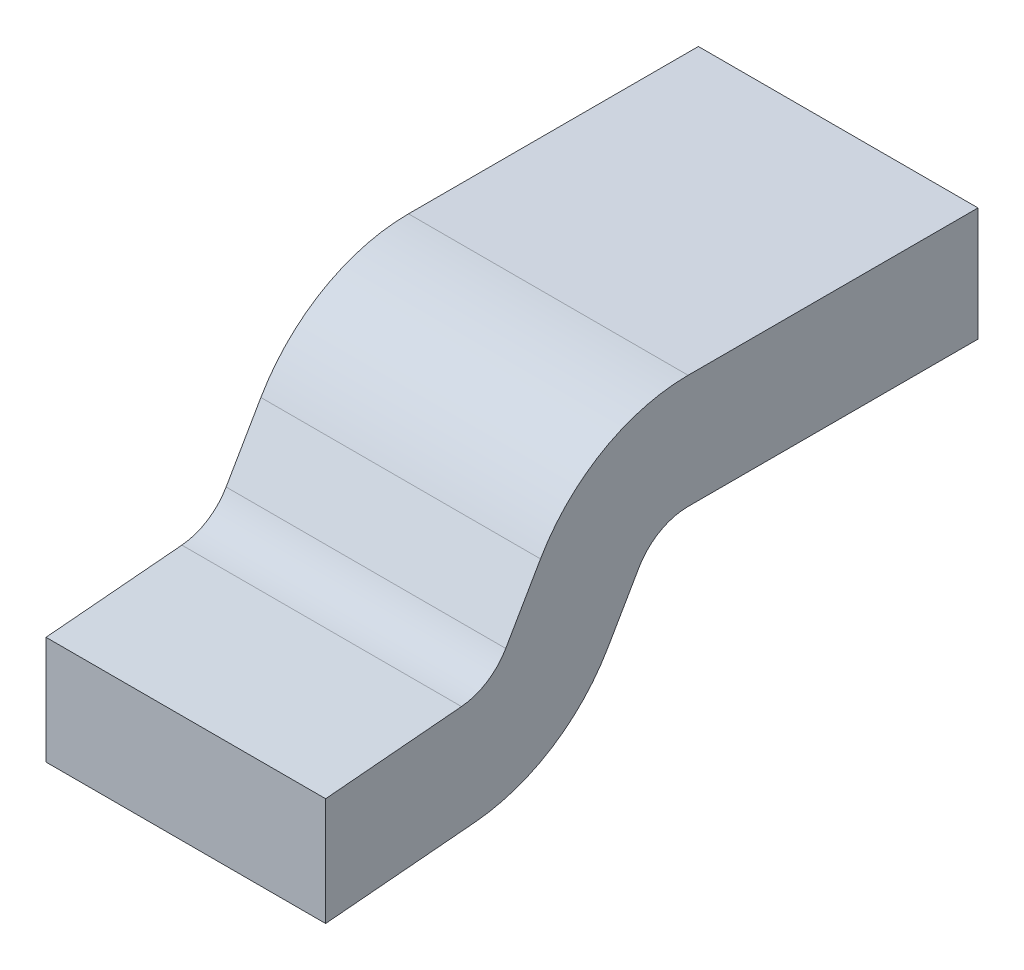
ISO-10303-21;
HEADER;
FILE_DESCRIPTION(('STEP AP214'),'2;1');
FILE_NAME('part.step','',(''),(''),'','','');
FILE_SCHEMA(('AUTOMOTIVE_DESIGN { 1 0 10303 214 1 1 1 1 }'));
ENDSEC;
DATA;
#1=APPLICATION_CONTEXT('core data for automotive mechanical design processes');
#2=APPLICATION_PROTOCOL_DEFINITION('international standard','automotive_design',2000,#1);
#3=PRODUCT_CONTEXT('',#1,'mechanical');
#4=PRODUCT('Part','Part','',(#3));
#5=PRODUCT_RELATED_PRODUCT_CATEGORY('part','',(#4));
#6=PRODUCT_DEFINITION_FORMATION('','',#4);
#7=PRODUCT_DEFINITION_CONTEXT('part definition',#1,'design');
#8=PRODUCT_DEFINITION('design','',#6,#7);
#9=PRODUCT_DEFINITION_SHAPE('','',#8);
#10=(LENGTH_UNIT() NAMED_UNIT(*) SI_UNIT(.MILLI.,.METRE.));
#11=(NAMED_UNIT(*) PLANE_ANGLE_UNIT() SI_UNIT($,.RADIAN.));
#12=(NAMED_UNIT(*) SI_UNIT($,.STERADIAN.) SOLID_ANGLE_UNIT());
#13=UNCERTAINTY_MEASURE_WITH_UNIT(LENGTH_MEASURE(1.E-05),#10,'distance_accuracy_value','');
#14=(GEOMETRIC_REPRESENTATION_CONTEXT(3) GLOBAL_UNCERTAINTY_ASSIGNED_CONTEXT((#13)) GLOBAL_UNIT_ASSIGNED_CONTEXT((#10,
#11,#12)) REPRESENTATION_CONTEXT('',''));
#15=CARTESIAN_POINT('',(0.,0.,0.));
#16=DIRECTION('',(0.,0.,1.));
#17=DIRECTION('',(1.,0.,0.));
#18=AXIS2_PLACEMENT_3D('',#15,#16,#17);
#19=CARTESIAN_POINT('',(-0.375,0.223608840880857,0.398828461671254));
#20=DIRECTION('',(1.,0.,0.));
#21=DIRECTION('',(0.,-0.843391445812889,-0.537299608346818));
#22=AXIS2_PLACEMENT_3D('',#19,#20,#21);
#23=CYLINDRICAL_SURFACE('',#22,0.1524);
#24=CARTESIAN_POINT('',(-0.375,0.223608840880857,0.398828461671254));
#25=DIRECTION('',(-1.,0.,0.));
#26=DIRECTION('',(0.,-0.843391445812889,-0.537299608346818));
#27=AXIS2_PLACEMENT_3D('',#24,#25,#26);
#28=CIRCLE('',#27,0.1524);
#29=CARTESIAN_POINT('',(-0.375,0.147408840880837,0.266846190134476));
#30=VERTEX_POINT('',#29);
#31=CARTESIAN_POINT('',(-0.375,0.0717887688916677,0.385545926476509));
#32=VERTEX_POINT('',#31);
#33=EDGE_CURVE('E11',#30,#32,#28,.T.);
#34=ORIENTED_EDGE('',*,*,#33,.T.);
#35=DIRECTION('',(1.,0.,0.));
#36=VECTOR('',#35,1.);
#37=CARTESIAN_POINT('',(-0.375,0.0717887688916754,0.38554592647651));
#38=LINE('',#37,#36);
#39=CARTESIAN_POINT('',(0.375,0.0717887688916677,0.385545926476509));
#40=VERTEX_POINT('',#39);
#41=EDGE_CURVE('E24',#32,#40,#38,.T.);
#42=ORIENTED_EDGE('',*,*,#41,.T.);
#43=CARTESIAN_POINT('',(0.375,0.223608840880857,0.398828461671254));
#44=DIRECTION('',(1.,0.,0.));
#45=DIRECTION('',(0.,-0.843391445812889,-0.537299608346818));
#46=AXIS2_PLACEMENT_3D('',#43,#44,#45);
#47=CIRCLE('',#46,0.1524);
#48=CARTESIAN_POINT('',(0.375,0.147408840880838,0.266846190134478));
#49=VERTEX_POINT('',#48);
#50=EDGE_CURVE('E202',#40,#49,#47,.T.);
#51=ORIENTED_EDGE('',*,*,#50,.T.);
#52=DIRECTION('',(-1.,0.,0.));
#53=VECTOR('',#52,1.);
#54=CARTESIAN_POINT('',(-0.375,0.147408840880855,0.266846190134507));
#55=LINE('',#54,#53);
#56=EDGE_CURVE('E36',#49,#30,#55,.T.);
#57=ORIENTED_EDGE('',*,*,#56,.T.);
#58=EDGE_LOOP('',(#34,#42,#51,#57));
#59=FACE_BOUND('',#58,.T.);
#60=ADVANCED_FACE('F17',(#59),#23,.F.);
#61=CARTESIAN_POINT('',(-0.375,0.0796796527909721,0.295352710792537));
#62=DIRECTION('',(0.,0.996194698091745,0.087155742747664));
#63=DIRECTION('',(0.,-0.087155742747664,0.996194698091745));
#64=AXIS2_PLACEMENT_3D('',#61,#62,#63);
#65=PLANE('',#64);
#66=ORIENTED_EDGE('',*,*,#41,.F.);
#67=DIRECTION('',(0.,-0.087155742747664,0.996194698091745));
#68=VECTOR('',#67,1.);
#69=CARTESIAN_POINT('',(-0.375,0.0727652026207921,0.374385237882437));
#70=LINE('',#69,#68);
#71=CARTESIAN_POINT('',(-0.375,0.0399031690825243,0.75));
#72=VERTEX_POINT('',#71);
#73=EDGE_CURVE('E199',#32,#72,#70,.T.);
#74=ORIENTED_EDGE('',*,*,#73,.T.);
#75=DIRECTION('',(-1.,0.,0.));
#76=VECTOR('',#75,1.);
#77=CARTESIAN_POINT('',(0.0375,0.0399031690825243,0.75));
#78=LINE('',#77,#76);
#79=CARTESIAN_POINT('',(0.375,0.0399031690825165,0.75));
#80=VERTEX_POINT('',#79);
#81=EDGE_CURVE('E196',#80,#72,#78,.T.);
#82=ORIENTED_EDGE('',*,*,#81,.F.);
#83=DIRECTION('',(0.,-0.087155742747664,0.996194698091745));
#84=VECTOR('',#83,1.);
#85=CARTESIAN_POINT('',(0.375,0.0727652026207921,0.374385237882437));
#86=LINE('',#85,#84);
#87=EDGE_CURVE('E194',#40,#80,#86,.T.);
#88=ORIENTED_EDGE('',*,*,#87,.F.);
#89=EDGE_LOOP('',(#66,#74,#82,#88));
#90=FACE_BOUND('',#89,.T.);
#91=ADVANCED_FACE('F204',(#90),#65,.T.);
#92=CARTESIAN_POINT('',(-0.375,0.,0.));
#93=DIRECTION('',(1.,0.,0.));
#94=DIRECTION('',(0.,0.,-1.));
#95=AXIS2_PLACEMENT_3D('',#92,#93,#94);
#96=PLANE('',#95);
#97=DIRECTION('',(0.,0.866025403784429,-0.500000000000017));
#98=VECTOR('',#97,1.);
#99=CARTESIAN_POINT('',(-0.375,0.1643243897794,0.2570799934244));
#100=LINE('',#99,#98);
#101=CARTESIAN_POINT('',(-0.375,0.3088,0.1736669609722));
#102=VERTEX_POINT('',#101);
#103=EDGE_CURVE('E192',#30,#102,#100,.T.);
#104=ORIENTED_EDGE('',*,*,#103,.T.);
#105=CARTESIAN_POINT('',(-0.375,0.0802,-0.222279853638));
#106=DIRECTION('',(-1.,0.,0.));
#107=DIRECTION('',(0.,0.500000000000017,0.866025403784429));
#108=AXIS2_PLACEMENT_3D('',#105,#106,#107);
#109=CIRCLE('',#108,0.4572);
#110=CARTESIAN_POINT('',(-0.375,0.5374,-0.222279853638));
#111=VERTEX_POINT('',#110);
#112=EDGE_CURVE('E190',#102,#111,#109,.T.);
#113=ORIENTED_EDGE('',*,*,#112,.T.);
#114=DIRECTION('',(0.,0.,1.));
#115=VECTOR('',#114,1.);
#116=CARTESIAN_POINT('',(-0.375,0.5374,-0.9998));
#117=LINE('',#116,#115);
#118=CARTESIAN_POINT('',(-0.375,0.5374,-0.9998));
#119=VERTEX_POINT('',#118);
#120=EDGE_CURVE('E187',#119,#111,#117,.T.);
#121=ORIENTED_EDGE('',*,*,#120,.F.);
#122=DIRECTION('',(0.,1.,0.));
#123=VECTOR('',#122,1.);
#124=CARTESIAN_POINT('',(-0.375,0.2326,-0.9998));
#125=LINE('',#124,#123);
#126=CARTESIAN_POINT('',(-0.375,0.2326,-0.9998));
#127=VERTEX_POINT('',#126);
#128=EDGE_CURVE('E184',#127,#119,#125,.T.);
#129=ORIENTED_EDGE('',*,*,#128,.F.);
#130=DIRECTION('',(0.,0.,-1.));
#131=VECTOR('',#130,1.);
#132=CARTESIAN_POINT('',(-0.375,0.2326,-0.222279853638));
#133=LINE('',#132,#131);
#134=CARTESIAN_POINT('',(-0.375,0.2326,-0.222279853638));
#135=VERTEX_POINT('',#134);
#136=EDGE_CURVE('E181',#135,#127,#133,.T.);
#137=ORIENTED_EDGE('',*,*,#136,.F.);
#138=CARTESIAN_POINT('',(-0.375,0.0802,-0.222279853638));
#139=DIRECTION('',(1.,0.,0.));
#140=DIRECTION('',(0.,1.,0.));
#141=AXIS2_PLACEMENT_3D('',#138,#139,#140);
#142=CIRCLE('',#141,0.1524);
#143=CARTESIAN_POINT('',(-0.375,0.1564,-0.09029758210126));
#144=VERTEX_POINT('',#143);
#145=EDGE_CURVE('E179',#135,#144,#142,.T.);
#146=ORIENTED_EDGE('',*,*,#145,.T.);
#147=DIRECTION('',(0.,-0.866025403784429,0.500000000000017));
#148=VECTOR('',#147,1.);
#149=CARTESIAN_POINT('',(-0.375,0.1564,-0.09029758210126));
#150=LINE('',#149,#148);
#151=CARTESIAN_POINT('',(-0.375,0.01192438977944,-0.006884549649082));
#152=VERTEX_POINT('',#151);
#153=EDGE_CURVE('E177',#144,#152,#150,.T.);
#154=ORIENTED_EDGE('',*,*,#153,.T.);
#155=CARTESIAN_POINT('',(-0.375,0.2405243897794,0.3890622649612));
#156=DIRECTION('',(-1.,0.,0.));
#157=DIRECTION('',(0.,-0.500000000000017,-0.866025403784429));
#158=AXIS2_PLACEMENT_3D('',#155,#156,#157);
#159=CIRCLE('',#158,0.4572);
#160=CARTESIAN_POINT('',(-0.375,-0.2149358261881,0.3492146593769));
#161=VERTEX_POINT('',#160);
#162=EDGE_CURVE('E175',#152,#161,#159,.T.);
#163=ORIENTED_EDGE('',*,*,#162,.T.);
#164=DIRECTION('',(0.,0.087155742747664,-0.996194698091745));
#165=VECTOR('',#164,1.);
#166=CARTESIAN_POINT('',(-0.375,-0.25,0.75));
#167=LINE('',#166,#165);
#168=CARTESIAN_POINT('',(-0.375,-0.25,0.75));
#169=VERTEX_POINT('',#168);
#170=EDGE_CURVE('E129',#169,#161,#167,.T.);
#171=ORIENTED_EDGE('',*,*,#170,.F.);
#172=DIRECTION('',(0.,1.,0.));
#173=VECTOR('',#172,1.);
#174=CARTESIAN_POINT('',(-0.375,-0.25,0.75));
#175=LINE('',#174,#173);
#176=EDGE_CURVE('E171',#169,#72,#175,.T.);
#177=ORIENTED_EDGE('',*,*,#176,.T.);
#178=ORIENTED_EDGE('',*,*,#73,.F.);
#179=ORIENTED_EDGE('',*,*,#33,.F.);
#180=EDGE_LOOP('',(#104,#113,#121,#129,#137,#146,#154,#163,#171,#177,#178,#179));
#181=FACE_BOUND('',#180,.T.);
#182=ADVANCED_FACE('F209',(#181),#96,.F.);
#183=CARTESIAN_POINT('',(-0.375,0.1524,0.2639645430735));
#184=DIRECTION('',(0.,0.500000000000017,0.866025403784429));
#185=DIRECTION('',(0.,-0.866025403784429,0.500000000000017));
#186=AXIS2_PLACEMENT_3D('',#183,#184,#185);
#187=PLANE('',#186);
#188=ORIENTED_EDGE('',*,*,#56,.F.);
#189=DIRECTION('',(0.,-0.866025403784429,0.500000000000017));
#190=VECTOR('',#189,1.);
#191=CARTESIAN_POINT('',(0.375,0.3088,0.1736669609722));
#192=LINE('',#191,#190);
#193=CARTESIAN_POINT('',(0.375,0.3088,0.1736669609722));
#194=VERTEX_POINT('',#193);
#195=EDGE_CURVE('E169',#194,#49,#192,.T.);
#196=ORIENTED_EDGE('',*,*,#195,.F.);
#197=DIRECTION('',(1.,0.,0.));
#198=VECTOR('',#197,1.);
#199=CARTESIAN_POINT('',(-0.375,0.3088,0.1736669609722));
#200=LINE('',#199,#198);
#201=EDGE_CURVE('E166',#102,#194,#200,.T.);
#202=ORIENTED_EDGE('',*,*,#201,.F.);
#203=ORIENTED_EDGE('',*,*,#103,.F.);
#204=EDGE_LOOP('',(#188,#196,#202,#203));
#205=FACE_BOUND('',#204,.T.);
#206=ADVANCED_FACE('F235',(#205),#187,.T.);
#207=CARTESIAN_POINT('',(0.45,-0.25,0.75));
#208=DIRECTION('',(0.,0.,-1.));
#209=DIRECTION('',(0.,1.,0.));
#210=AXIS2_PLACEMENT_3D('',#207,#208,#209);
#211=PLANE('',#210);
#212=ORIENTED_EDGE('',*,*,#176,.F.);
#213=DIRECTION('',(1.,0.,0.));
#214=VECTOR('',#213,1.);
#215=CARTESIAN_POINT('',(-0.375,-0.25,0.75));
#216=LINE('',#215,#214);
#217=CARTESIAN_POINT('',(0.375,-0.25,0.75));
#218=VERTEX_POINT('',#217);
#219=EDGE_CURVE('E164',#169,#218,#216,.T.);
#220=ORIENTED_EDGE('',*,*,#219,.T.);
#221=DIRECTION('',(0.,1.,0.));
#222=VECTOR('',#221,1.);
#223=CARTESIAN_POINT('',(0.375,-0.25,0.75));
#224=LINE('',#223,#222);
#225=EDGE_CURVE('E113',#218,#80,#224,.T.);
#226=ORIENTED_EDGE('',*,*,#225,.T.);
#227=ORIENTED_EDGE('',*,*,#81,.T.);
#228=EDGE_LOOP('',(#212,#220,#226,#227));
#229=FACE_BOUND('',#228,.T.);
#230=ADVANCED_FACE('F207',(#229),#211,.F.);
#231=CARTESIAN_POINT('',(-0.375,0.0802,-0.222279853638));
#232=DIRECTION('',(-1.,0.,0.));
#233=DIRECTION('',(0.,0.500000000000017,0.866025403784429));
#234=AXIS2_PLACEMENT_3D('',#231,#232,#233);
#235=CYLINDRICAL_SURFACE('',#234,0.4572);
#236=ORIENTED_EDGE('',*,*,#201,.T.);
#237=CARTESIAN_POINT('',(0.375,0.0802,-0.222279853638));
#238=DIRECTION('',(-1.,0.,0.));
#239=DIRECTION('',(0.,0.500000000000017,0.866025403784429));
#240=AXIS2_PLACEMENT_3D('',#237,#238,#239);
#241=CIRCLE('',#240,0.4572);
#242=CARTESIAN_POINT('',(0.375,0.5374,-0.222279853638));
#243=VERTEX_POINT('',#242);
#244=EDGE_CURVE('E161',#194,#243,#241,.T.);
#245=ORIENTED_EDGE('',*,*,#244,.T.);
#246=DIRECTION('',(1.,0.,0.));
#247=VECTOR('',#246,1.);
#248=CARTESIAN_POINT('',(-0.375,0.5374,-0.222279853638));
#249=LINE('',#248,#247);
#250=EDGE_CURVE('E158',#111,#243,#249,.T.);
#251=ORIENTED_EDGE('',*,*,#250,.F.);
#252=ORIENTED_EDGE('',*,*,#112,.F.);
#253=EDGE_LOOP('',(#236,#245,#251,#252));
#254=FACE_BOUND('',#253,.T.);
#255=ADVANCED_FACE('F231',(#254),#235,.T.);
#256=CARTESIAN_POINT('',(-0.375,0.5374,-0.9998));
#257=DIRECTION('',(0.,1.,0.));
#258=DIRECTION('',(0.,0.,1.));
#259=AXIS2_PLACEMENT_3D('',#256,#257,#258);
#260=PLANE('',#259);
#261=ORIENTED_EDGE('',*,*,#120,.T.);
#262=ORIENTED_EDGE('',*,*,#250,.T.);
#263=DIRECTION('',(0.,0.,1.));
#264=VECTOR('',#263,1.);
#265=CARTESIAN_POINT('',(0.375,0.5374,-0.9998));
#266=LINE('',#265,#264);
#267=CARTESIAN_POINT('',(0.375,0.5374,-0.9998));
#268=VERTEX_POINT('',#267);
#269=EDGE_CURVE('E155',#268,#243,#266,.T.);
#270=ORIENTED_EDGE('',*,*,#269,.F.);
#271=DIRECTION('',(1.,0.,0.));
#272=VECTOR('',#271,1.);
#273=CARTESIAN_POINT('',(-0.375,0.5374,-0.9998));
#274=LINE('',#273,#272);
#275=EDGE_CURVE('E152',#119,#268,#274,.T.);
#276=ORIENTED_EDGE('',*,*,#275,.F.);
#277=EDGE_LOOP('',(#261,#262,#270,#276));
#278=FACE_BOUND('',#277,.T.);
#279=ADVANCED_FACE('F227',(#278),#260,.T.);
#280=CARTESIAN_POINT('',(-0.375,0.2326,-0.9998));
#281=DIRECTION('',(0.,0.,-1.));
#282=DIRECTION('',(0.,1.,0.));
#283=AXIS2_PLACEMENT_3D('',#280,#281,#282);
#284=PLANE('',#283);
#285=ORIENTED_EDGE('',*,*,#128,.T.);
#286=ORIENTED_EDGE('',*,*,#275,.T.);
#287=DIRECTION('',(0.,1.,0.));
#288=VECTOR('',#287,1.);
#289=CARTESIAN_POINT('',(0.375,0.2326,-0.9998));
#290=LINE('',#289,#288);
#291=CARTESIAN_POINT('',(0.375,0.2326,-0.9998));
#292=VERTEX_POINT('',#291);
#293=EDGE_CURVE('E149',#292,#268,#290,.T.);
#294=ORIENTED_EDGE('',*,*,#293,.F.);
#295=DIRECTION('',(1.,0.,0.));
#296=VECTOR('',#295,1.);
#297=CARTESIAN_POINT('',(-0.375,0.2326,-0.9998));
#298=LINE('',#297,#296);
#299=EDGE_CURVE('E146',#127,#292,#298,.T.);
#300=ORIENTED_EDGE('',*,*,#299,.F.);
#301=EDGE_LOOP('',(#285,#286,#294,#300));
#302=FACE_BOUND('',#301,.T.);
#303=ADVANCED_FACE('F223',(#302),#284,.T.);
#304=CARTESIAN_POINT('',(-0.375,0.2326,-0.1342916726135));
#305=DIRECTION('',(0.,-1.,0.));
#306=DIRECTION('',(0.,0.,-1.));
#307=AXIS2_PLACEMENT_3D('',#304,#305,#306);
#308=PLANE('',#307);
#309=ORIENTED_EDGE('',*,*,#136,.T.);
#310=ORIENTED_EDGE('',*,*,#299,.T.);
#311=DIRECTION('',(0.,0.,-1.));
#312=VECTOR('',#311,1.);
#313=CARTESIAN_POINT('',(0.375,0.2326,-0.222279853638));
#314=LINE('',#313,#312);
#315=CARTESIAN_POINT('',(0.375,0.2326,-0.222279853638));
#316=VERTEX_POINT('',#315);
#317=EDGE_CURVE('E143',#316,#292,#314,.T.);
#318=ORIENTED_EDGE('',*,*,#317,.F.);
#319=DIRECTION('',(1.,0.,0.));
#320=VECTOR('',#319,1.);
#321=CARTESIAN_POINT('',(-0.375,0.2326,-0.222279853638));
#322=LINE('',#321,#320);
#323=EDGE_CURVE('E140',#135,#316,#322,.T.);
#324=ORIENTED_EDGE('',*,*,#323,.F.);
#325=EDGE_LOOP('',(#309,#310,#318,#324));
#326=FACE_BOUND('',#325,.T.);
#327=ADVANCED_FACE('F220',(#326),#308,.T.);
#328=CARTESIAN_POINT('',(-0.375,0.0802,-0.222279853638));
#329=DIRECTION('',(1.,0.,0.));
#330=DIRECTION('',(0.,1.,0.));
#331=AXIS2_PLACEMENT_3D('',#328,#329,#330);
#332=CYLINDRICAL_SURFACE('',#331,0.1524);
#333=ORIENTED_EDGE('',*,*,#323,.T.);
#334=CARTESIAN_POINT('',(0.375,0.0802,-0.222279853638));
#335=DIRECTION('',(1.,0.,0.));
#336=DIRECTION('',(0.,1.,0.));
#337=AXIS2_PLACEMENT_3D('',#334,#335,#336);
#338=CIRCLE('',#337,0.1524);
#339=CARTESIAN_POINT('',(0.375,0.1564,-0.09029758210126));
#340=VERTEX_POINT('',#339);
#341=EDGE_CURVE('E137',#316,#340,#338,.T.);
#342=ORIENTED_EDGE('',*,*,#341,.T.);
#343=DIRECTION('',(1.,0.,0.));
#344=VECTOR('',#343,1.);
#345=CARTESIAN_POINT('',(-0.375,0.1564,-0.09029758210126));
#346=LINE('',#345,#344);
#347=EDGE_CURVE('E135',#144,#340,#346,.T.);
#348=ORIENTED_EDGE('',*,*,#347,.F.);
#349=ORIENTED_EDGE('',*,*,#145,.F.);
#350=EDGE_LOOP('',(#333,#342,#348,#349));
#351=FACE_BOUND('',#350,.T.);
#352=ADVANCED_FACE('F216',(#351),#332,.F.);
#353=CARTESIAN_POINT('',(-0.375,-0.1941924756776,0.112117078107));
#354=DIRECTION('',(0.,-0.500000000000017,-0.866025403784429));
#355=DIRECTION('',(0.,0.866025403784429,-0.500000000000017));
#356=AXIS2_PLACEMENT_3D('',#353,#354,#355);
#357=PLANE('',#356);
#358=DIRECTION('',(0.,0.866025403784429,-0.500000000000017));
#359=VECTOR('',#358,1.);
#360=CARTESIAN_POINT('',(0.375,0.01192438977944,-0.006884549649082));
#361=LINE('',#360,#359);
#362=CARTESIAN_POINT('',(0.375,0.01192438977944,-0.006884549649082));
#363=VERTEX_POINT('',#362);
#364=EDGE_CURVE('E133',#363,#340,#361,.T.);
#365=ORIENTED_EDGE('',*,*,#364,.F.);
#366=DIRECTION('',(1.,0.,0.));
#367=VECTOR('',#366,1.);
#368=CARTESIAN_POINT('',(-0.375,0.01192438977944,-0.006884549649082));
#369=LINE('',#368,#367);
#370=EDGE_CURVE('E117',#152,#363,#369,.T.);
#371=ORIENTED_EDGE('',*,*,#370,.F.);
#372=ORIENTED_EDGE('',*,*,#153,.F.);
#373=ORIENTED_EDGE('',*,*,#347,.T.);
#374=EDGE_LOOP('',(#365,#371,#372,#373));
#375=FACE_BOUND('',#374,.T.);
#376=ADVANCED_FACE('F212',(#375),#357,.T.);
#377=CARTESIAN_POINT('',(0.375,0.,0.));
#378=DIRECTION('',(1.,0.,0.));
#379=DIRECTION('',(0.,0.,-1.));
#380=AXIS2_PLACEMENT_3D('',#377,#378,#379);
#381=PLANE('',#380);
#382=ORIENTED_EDGE('',*,*,#195,.T.);
#383=ORIENTED_EDGE('',*,*,#50,.F.);
#384=ORIENTED_EDGE('',*,*,#87,.T.);
#385=ORIENTED_EDGE('',*,*,#225,.F.);
#386=DIRECTION('',(0.,0.087155742747664,-0.996194698091745));
#387=VECTOR('',#386,1.);
#388=CARTESIAN_POINT('',(0.375,-0.25,0.75));
#389=LINE('',#388,#387);
#390=CARTESIAN_POINT('',(0.375,-0.2149358261881,0.3492146593769));
#391=VERTEX_POINT('',#390);
#392=EDGE_CURVE('E105',#218,#391,#389,.T.);
#393=ORIENTED_EDGE('',*,*,#392,.T.);
#394=CARTESIAN_POINT('',(0.375,0.2405243897794,0.3890622649612));
#395=DIRECTION('',(-1.,0.,0.));
#396=DIRECTION('',(0.,-0.500000000000017,-0.866025403784429));
#397=AXIS2_PLACEMENT_3D('',#394,#395,#396);
#398=CIRCLE('',#397,0.4572);
#399=EDGE_CURVE('E110',#363,#391,#398,.T.);
#400=ORIENTED_EDGE('',*,*,#399,.F.);
#401=ORIENTED_EDGE('',*,*,#364,.T.);
#402=ORIENTED_EDGE('',*,*,#341,.F.);
#403=ORIENTED_EDGE('',*,*,#317,.T.);
#404=ORIENTED_EDGE('',*,*,#293,.T.);
#405=ORIENTED_EDGE('',*,*,#269,.T.);
#406=ORIENTED_EDGE('',*,*,#244,.F.);
#407=EDGE_LOOP('',(#382,#383,#384,#385,#393,#400,#401,#402,#403,#404,#405,#406));
#408=FACE_BOUND('',#407,.T.);
#409=ADVANCED_FACE('F108',(#408),#381,.T.);
#410=CARTESIAN_POINT('',(-0.375,0.2405243897794,0.3890622649612));
#411=DIRECTION('',(-1.,0.,0.));
#412=DIRECTION('',(0.,-0.500000000000017,-0.866025403784429));
#413=AXIS2_PLACEMENT_3D('',#410,#411,#412);
#414=CYLINDRICAL_SURFACE('',#413,0.4572);
#415=ORIENTED_EDGE('',*,*,#370,.T.);
#416=ORIENTED_EDGE('',*,*,#399,.T.);
#417=DIRECTION('',(1.,0.,0.));
#418=VECTOR('',#417,1.);
#419=CARTESIAN_POINT('',(-0.375,-0.2149358261881,0.3492146593769));
#420=LINE('',#419,#418);
#421=EDGE_CURVE('E124',#161,#391,#420,.T.);
#422=ORIENTED_EDGE('',*,*,#421,.F.);
#423=ORIENTED_EDGE('',*,*,#162,.F.);
#424=EDGE_LOOP('',(#415,#416,#422,#423));
#425=FACE_BOUND('',#424,.T.);
#426=ADVANCED_FACE('F122',(#425),#414,.T.);
#427=CARTESIAN_POINT('',(-0.375,-0.25,0.75));
#428=DIRECTION('',(0.,-0.996194698091745,-0.087155742747664));
#429=DIRECTION('',(0.,0.087155742747664,-0.996194698091745));
#430=AXIS2_PLACEMENT_3D('',#427,#428,#429);
#431=PLANE('',#430);
#432=ORIENTED_EDGE('',*,*,#219,.F.);
#433=ORIENTED_EDGE('',*,*,#170,.T.);
#434=ORIENTED_EDGE('',*,*,#421,.T.);
#435=ORIENTED_EDGE('',*,*,#392,.F.);
#436=EDGE_LOOP('',(#432,#433,#434,#435));
#437=FACE_BOUND('',#436,.T.);
#438=ADVANCED_FACE('F128',(#437),#431,.T.);
#439=CLOSED_SHELL('',(#60,#91,#182,#206,#230,#255,#279,#303,#327,#352,#376,#409,#426,#438));
#440=MANIFOLD_SOLID_BREP('B1',#439);
#441=ADVANCED_BREP_SHAPE_REPRESENTATION('',(#18,#440),#14);
#442=SHAPE_DEFINITION_REPRESENTATION(#9,#441);
ENDSEC;
END-ISO-10303-21;
